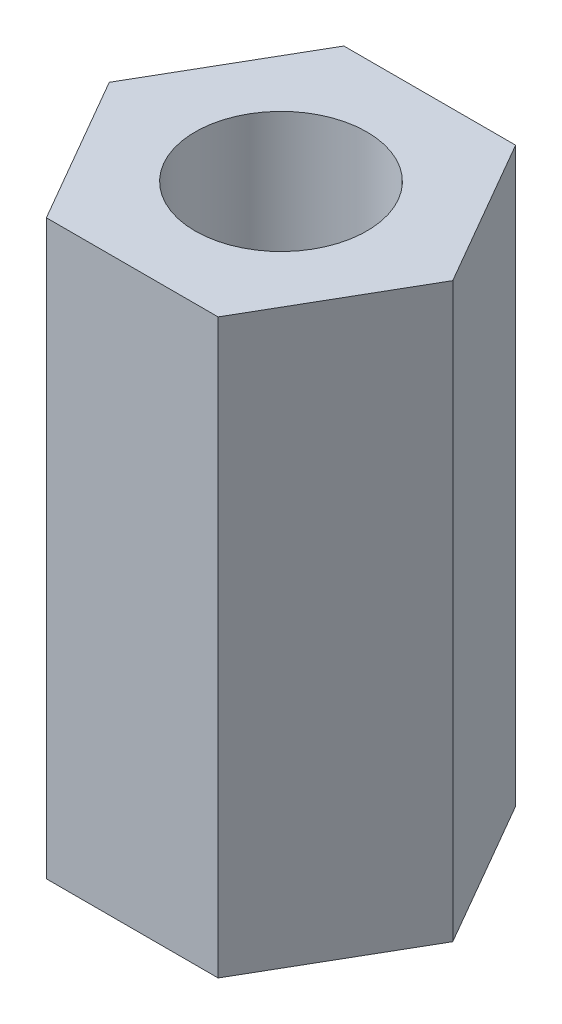
ISO-10303-21;
HEADER;
FILE_DESCRIPTION(('STEP AP214'),'2;1');
FILE_NAME('part.step','',(''),(''),'','','');
FILE_SCHEMA(('AUTOMOTIVE_DESIGN { 1 0 10303 214 1 1 1 1 }'));
ENDSEC;
DATA;
#1=APPLICATION_CONTEXT('core data for automotive mechanical design processes');
#2=APPLICATION_PROTOCOL_DEFINITION('international standard','automotive_design',2000,#1);
#3=PRODUCT_CONTEXT('',#1,'mechanical');
#4=PRODUCT('Part','Part','',(#3));
#5=PRODUCT_RELATED_PRODUCT_CATEGORY('part','',(#4));
#6=PRODUCT_DEFINITION_FORMATION('','',#4);
#7=PRODUCT_DEFINITION_CONTEXT('part definition',#1,'design');
#8=PRODUCT_DEFINITION('design','',#6,#7);
#9=PRODUCT_DEFINITION_SHAPE('','',#8);
#10=(LENGTH_UNIT() NAMED_UNIT(*) SI_UNIT(.MILLI.,.METRE.));
#11=(NAMED_UNIT(*) PLANE_ANGLE_UNIT() SI_UNIT($,.RADIAN.));
#12=(NAMED_UNIT(*) SI_UNIT($,.STERADIAN.) SOLID_ANGLE_UNIT());
#13=UNCERTAINTY_MEASURE_WITH_UNIT(LENGTH_MEASURE(1.E-05),#10,'distance_accuracy_value','');
#14=(GEOMETRIC_REPRESENTATION_CONTEXT(3) GLOBAL_UNCERTAINTY_ASSIGNED_CONTEXT((#13)) GLOBAL_UNIT_ASSIGNED_CONTEXT((#10,
#11,#12)) REPRESENTATION_CONTEXT('',''));
#15=CARTESIAN_POINT('',(0.,0.,0.));
#16=DIRECTION('',(0.,0.,1.));
#17=DIRECTION('',(1.,0.,0.));
#18=AXIS2_PLACEMENT_3D('',#15,#16,#17);
#19=CARTESIAN_POINT('',(0.,10.,0.));
#20=DIRECTION('',(0.,1.,0.));
#21=DIRECTION('',(0.,0.,1.));
#22=AXIS2_PLACEMENT_3D('',#19,#20,#21);
#23=PLANE('',#22);
#24=DIRECTION('',(-1.,0.,0.));
#25=VECTOR('',#24,1.);
#26=CARTESIAN_POINT('',(1.5,10.,-2.59807621135332));
#27=LINE('',#26,#25);
#28=CARTESIAN_POINT('',(1.5,10.,-2.59807621135332));
#29=VERTEX_POINT('',#28);
#30=CARTESIAN_POINT('',(-1.5,10.,-2.59807621135332));
#31=VERTEX_POINT('',#30);
#32=EDGE_CURVE('E129',#29,#31,#27,.T.);
#33=ORIENTED_EDGE('',*,*,#32,.T.);
#34=DIRECTION('',(-0.5,0.,0.866025403784439));
#35=VECTOR('',#34,1.);
#36=CARTESIAN_POINT('',(-1.5,10.,-2.59807621135332));
#37=LINE('',#36,#35);
#38=CARTESIAN_POINT('',(-3.,10.,0.));
#39=VERTEX_POINT('',#38);
#40=EDGE_CURVE('E87',#31,#39,#37,.T.);
#41=ORIENTED_EDGE('',*,*,#40,.T.);
#42=DIRECTION('',(0.5,0.,0.866025403784439));
#43=VECTOR('',#42,1.);
#44=CARTESIAN_POINT('',(-3.,10.,0.));
#45=LINE('',#44,#43);
#46=CARTESIAN_POINT('',(-1.5,10.,2.59807621135332));
#47=VERTEX_POINT('',#46);
#48=EDGE_CURVE('E100',#39,#47,#45,.T.);
#49=ORIENTED_EDGE('',*,*,#48,.T.);
#50=DIRECTION('',(1.,0.,0.));
#51=VECTOR('',#50,1.);
#52=CARTESIAN_POINT('',(-1.5,10.,2.59807621135332));
#53=LINE('',#52,#51);
#54=CARTESIAN_POINT('',(1.5,10.,2.59807621135332));
#55=VERTEX_POINT('',#54);
#56=EDGE_CURVE('E94',#47,#55,#53,.T.);
#57=ORIENTED_EDGE('',*,*,#56,.T.);
#58=DIRECTION('',(0.5,0.,-0.866025403784438));
#59=VECTOR('',#58,1.);
#60=CARTESIAN_POINT('',(1.5,10.,2.59807621135332));
#61=LINE('',#60,#59);
#62=CARTESIAN_POINT('',(3.,10.,0.));
#63=VERTEX_POINT('',#62);
#64=EDGE_CURVE('E98',#55,#63,#61,.T.);
#65=ORIENTED_EDGE('',*,*,#64,.T.);
#66=DIRECTION('',(-0.5,0.,-0.866025403784439));
#67=VECTOR('',#66,1.);
#68=CARTESIAN_POINT('',(3.,10.,0.));
#69=LINE('',#68,#67);
#70=EDGE_CURVE('E50',#63,#29,#69,.T.);
#71=ORIENTED_EDGE('',*,*,#70,.T.);
#72=EDGE_LOOP('',(#33,#41,#49,#57,#65,#71));
#73=FACE_BOUND('',#72,.T.);
#74=CARTESIAN_POINT('',(0.,10.,0.));
#75=DIRECTION('',(0.,1.,0.));
#76=DIRECTION('',(0.,0.,1.));
#77=AXIS2_PLACEMENT_3D('',#74,#75,#76);
#78=CIRCLE('',#77,1.5);
#79=CARTESIAN_POINT('',(0.,10.,1.5));
#80=VERTEX_POINT('',#79);
#81=EDGE_CURVE('E122',#80,#80,#78,.T.);
#82=ORIENTED_EDGE('',*,*,#81,.F.);
#83=EDGE_LOOP('',(#82));
#84=FACE_BOUND('',#83,.T.);
#85=ADVANCED_FACE('F33',(#73,#84),#23,.T.);
#86=CARTESIAN_POINT('',(0.,0.,0.));
#87=DIRECTION('',(0.,1.,0.));
#88=DIRECTION('',(0.,0.,1.));
#89=AXIS2_PLACEMENT_3D('',#86,#87,#88);
#90=PLANE('',#89);
#91=DIRECTION('',(-1.,0.,0.));
#92=VECTOR('',#91,1.);
#93=CARTESIAN_POINT('',(1.5,0.,-2.59807621135332));
#94=LINE('',#93,#92);
#95=CARTESIAN_POINT('',(1.5,0.,-2.59807621135332));
#96=VERTEX_POINT('',#95);
#97=CARTESIAN_POINT('',(-1.5,0.,-2.59807621135332));
#98=VERTEX_POINT('',#97);
#99=EDGE_CURVE('E118',#96,#98,#94,.T.);
#100=ORIENTED_EDGE('',*,*,#99,.F.);
#101=DIRECTION('',(-0.5,0.,-0.866025403784439));
#102=VECTOR('',#101,1.);
#103=CARTESIAN_POINT('',(3.,0.,0.));
#104=LINE('',#103,#102);
#105=CARTESIAN_POINT('',(3.,0.,0.));
#106=VERTEX_POINT('',#105);
#107=EDGE_CURVE('E79',#106,#96,#104,.T.);
#108=ORIENTED_EDGE('',*,*,#107,.F.);
#109=DIRECTION('',(0.5,0.,-0.866025403784438));
#110=VECTOR('',#109,1.);
#111=CARTESIAN_POINT('',(1.5,0.,2.59807621135332));
#112=LINE('',#111,#110);
#113=CARTESIAN_POINT('',(1.5,0.,2.59807621135332));
#114=VERTEX_POINT('',#113);
#115=EDGE_CURVE('E73',#114,#106,#112,.T.);
#116=ORIENTED_EDGE('',*,*,#115,.F.);
#117=DIRECTION('',(1.,0.,0.));
#118=VECTOR('',#117,1.);
#119=CARTESIAN_POINT('',(-1.5,0.,2.59807621135332));
#120=LINE('',#119,#118);
#121=CARTESIAN_POINT('',(-1.5,0.,2.59807621135332));
#122=VERTEX_POINT('',#121);
#123=EDGE_CURVE('E108',#122,#114,#120,.T.);
#124=ORIENTED_EDGE('',*,*,#123,.F.);
#125=DIRECTION('',(0.5,0.,0.866025403784439));
#126=VECTOR('',#125,1.);
#127=CARTESIAN_POINT('',(-3.,0.,0.));
#128=LINE('',#127,#126);
#129=CARTESIAN_POINT('',(-3.,0.,0.));
#130=VERTEX_POINT('',#129);
#131=EDGE_CURVE('E124',#130,#122,#128,.T.);
#132=ORIENTED_EDGE('',*,*,#131,.F.);
#133=DIRECTION('',(-0.5,0.,0.866025403784439));
#134=VECTOR('',#133,1.);
#135=CARTESIAN_POINT('',(-1.5,0.,-2.59807621135332));
#136=LINE('',#135,#134);
#137=EDGE_CURVE('E121',#98,#130,#136,.T.);
#138=ORIENTED_EDGE('',*,*,#137,.F.);
#139=EDGE_LOOP('',(#100,#108,#116,#124,#132,#138));
#140=FACE_BOUND('',#139,.T.);
#141=CARTESIAN_POINT('',(0.,0.,0.));
#142=DIRECTION('',(0.,1.,0.));
#143=DIRECTION('',(0.,0.,1.));
#144=AXIS2_PLACEMENT_3D('',#141,#142,#143);
#145=CIRCLE('',#144,1.5);
#146=CARTESIAN_POINT('',(0.,0.,1.5));
#147=VERTEX_POINT('',#146);
#148=EDGE_CURVE('E222',#147,#147,#145,.T.);
#149=ORIENTED_EDGE('',*,*,#148,.T.);
#150=EDGE_LOOP('',(#149));
#151=FACE_BOUND('',#150,.T.);
#152=ADVANCED_FACE('F138',(#140,#151),#90,.F.);
#153=CARTESIAN_POINT('',(1.5,10.,-2.59807621135332));
#154=DIRECTION('',(0.,0.,1.));
#155=DIRECTION('',(1.,0.,0.));
#156=AXIS2_PLACEMENT_3D('',#153,#154,#155);
#157=PLANE('',#156);
#158=ORIENTED_EDGE('',*,*,#99,.T.);
#159=DIRECTION('',(0.,-1.,0.));
#160=VECTOR('',#159,1.);
#161=CARTESIAN_POINT('',(-1.5,10.,-2.59807621135332));
#162=LINE('',#161,#160);
#163=EDGE_CURVE('E11',#31,#98,#162,.T.);
#164=ORIENTED_EDGE('',*,*,#163,.F.);
#165=ORIENTED_EDGE('',*,*,#32,.F.);
#166=DIRECTION('',(0.,-1.,0.));
#167=VECTOR('',#166,1.);
#168=CARTESIAN_POINT('',(1.5,10.,-2.59807621135332));
#169=LINE('',#168,#167);
#170=EDGE_CURVE('E114',#29,#96,#169,.T.);
#171=ORIENTED_EDGE('',*,*,#170,.T.);
#172=EDGE_LOOP('',(#158,#164,#165,#171));
#173=FACE_BOUND('',#172,.T.);
#174=ADVANCED_FACE('F35',(#173),#157,.F.);
#175=CARTESIAN_POINT('',(-1.5,10.,-2.59807621135332));
#176=DIRECTION('',(0.866025403784439,0.,0.5));
#177=DIRECTION('',(0.5,0.,-0.866025403784439));
#178=AXIS2_PLACEMENT_3D('',#175,#176,#177);
#179=PLANE('',#178);
#180=ORIENTED_EDGE('',*,*,#137,.T.);
#181=DIRECTION('',(0.,-1.,0.));
#182=VECTOR('',#181,1.);
#183=CARTESIAN_POINT('',(-3.,10.,0.));
#184=LINE('',#183,#182);
#185=EDGE_CURVE('E42',#39,#130,#184,.T.);
#186=ORIENTED_EDGE('',*,*,#185,.F.);
#187=ORIENTED_EDGE('',*,*,#40,.F.);
#188=ORIENTED_EDGE('',*,*,#163,.T.);
#189=EDGE_LOOP('',(#180,#186,#187,#188));
#190=FACE_BOUND('',#189,.T.);
#191=ADVANCED_FACE('F163',(#190),#179,.F.);
#192=CARTESIAN_POINT('',(-3.,10.,0.));
#193=DIRECTION('',(0.866025403784439,0.,-0.5));
#194=DIRECTION('',(-0.5,0.,-0.866025403784439));
#195=AXIS2_PLACEMENT_3D('',#192,#193,#194);
#196=PLANE('',#195);
#197=ORIENTED_EDGE('',*,*,#131,.T.);
#198=DIRECTION('',(0.,-1.,0.));
#199=VECTOR('',#198,1.);
#200=CARTESIAN_POINT('',(-1.5,10.,2.59807621135332));
#201=LINE('',#200,#199);
#202=EDGE_CURVE('E109',#47,#122,#201,.T.);
#203=ORIENTED_EDGE('',*,*,#202,.F.);
#204=ORIENTED_EDGE('',*,*,#48,.F.);
#205=ORIENTED_EDGE('',*,*,#185,.T.);
#206=EDGE_LOOP('',(#197,#203,#204,#205));
#207=FACE_BOUND('',#206,.T.);
#208=ADVANCED_FACE('F135',(#207),#196,.F.);
#209=CARTESIAN_POINT('',(-1.5,10.,2.59807621135332));
#210=DIRECTION('',(0.,0.,-1.));
#211=DIRECTION('',(-1.,0.,0.));
#212=AXIS2_PLACEMENT_3D('',#209,#210,#211);
#213=PLANE('',#212);
#214=ORIENTED_EDGE('',*,*,#123,.T.);
#215=DIRECTION('',(0.,-1.,0.));
#216=VECTOR('',#215,1.);
#217=CARTESIAN_POINT('',(1.5,10.,2.59807621135332));
#218=LINE('',#217,#216);
#219=EDGE_CURVE('E105',#55,#114,#218,.T.);
#220=ORIENTED_EDGE('',*,*,#219,.F.);
#221=ORIENTED_EDGE('',*,*,#56,.F.);
#222=ORIENTED_EDGE('',*,*,#202,.T.);
#223=EDGE_LOOP('',(#214,#220,#221,#222));
#224=FACE_BOUND('',#223,.T.);
#225=ADVANCED_FACE('F106',(#224),#213,.F.);
#226=CARTESIAN_POINT('',(1.5,10.,2.59807621135332));
#227=DIRECTION('',(-0.866025403784439,0.,-0.5));
#228=DIRECTION('',(-0.5,0.,0.866025403784439));
#229=AXIS2_PLACEMENT_3D('',#226,#227,#228);
#230=PLANE('',#229);
#231=ORIENTED_EDGE('',*,*,#115,.T.);
#232=DIRECTION('',(0.,-1.,0.));
#233=VECTOR('',#232,1.);
#234=CARTESIAN_POINT('',(3.,10.,0.));
#235=LINE('',#234,#233);
#236=EDGE_CURVE('E110',#63,#106,#235,.T.);
#237=ORIENTED_EDGE('',*,*,#236,.F.);
#238=ORIENTED_EDGE('',*,*,#64,.F.);
#239=ORIENTED_EDGE('',*,*,#219,.T.);
#240=EDGE_LOOP('',(#231,#237,#238,#239));
#241=FACE_BOUND('',#240,.T.);
#242=ADVANCED_FACE('F112',(#241),#230,.F.);
#243=CARTESIAN_POINT('',(3.,10.,0.));
#244=DIRECTION('',(-0.866025403784439,0.,0.5));
#245=DIRECTION('',(0.5,0.,0.866025403784439));
#246=AXIS2_PLACEMENT_3D('',#243,#244,#245);
#247=PLANE('',#246);
#248=ORIENTED_EDGE('',*,*,#107,.T.);
#249=ORIENTED_EDGE('',*,*,#170,.F.);
#250=ORIENTED_EDGE('',*,*,#70,.F.);
#251=ORIENTED_EDGE('',*,*,#236,.T.);
#252=EDGE_LOOP('',(#248,#249,#250,#251));
#253=FACE_BOUND('',#252,.T.);
#254=ADVANCED_FACE('F143',(#253),#247,.F.);
#255=CARTESIAN_POINT('',(0.,10.,0.));
#256=DIRECTION('',(0.,-1.,0.));
#257=DIRECTION('',(0.,0.,-1.));
#258=AXIS2_PLACEMENT_3D('',#255,#256,#257);
#259=CYLINDRICAL_SURFACE('',#258,1.5);
#260=ORIENTED_EDGE('',*,*,#81,.T.);
#261=EDGE_LOOP('',(#260));
#262=FACE_BOUND('',#261,.T.);
#263=ORIENTED_EDGE('',*,*,#148,.F.);
#264=EDGE_LOOP('',(#263));
#265=FACE_BOUND('',#264,.T.);
#266=ADVANCED_FACE('F145',(#262,#265),#259,.F.);
#267=CLOSED_SHELL('',(#85,#152,#174,#191,#208,#225,#242,#254,#266));
#268=MANIFOLD_SOLID_BREP('B2',#267);
#269=ADVANCED_BREP_SHAPE_REPRESENTATION('',(#18,#268),#14);
#270=SHAPE_DEFINITION_REPRESENTATION(#9,#269);
ENDSEC;
END-ISO-10303-21;
